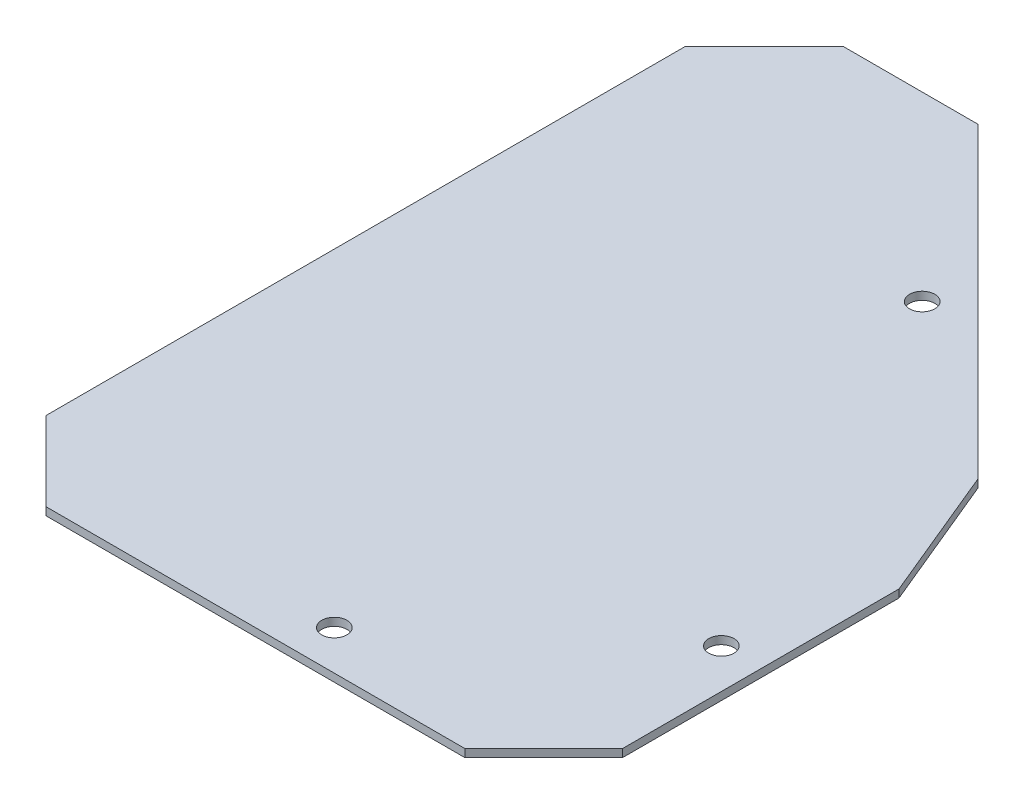
ISO-10303-21;
HEADER;
FILE_DESCRIPTION(('STEP AP214'),'2;1');
FILE_NAME('part.step','',(''),(''),'','','');
FILE_SCHEMA(('AUTOMOTIVE_DESIGN { 1 0 10303 214 1 1 1 1 }'));
ENDSEC;
DATA;
#1=APPLICATION_CONTEXT('core data for automotive mechanical design processes');
#2=APPLICATION_PROTOCOL_DEFINITION('international standard','automotive_design',2000,#1);
#3=PRODUCT_CONTEXT('',#1,'mechanical');
#4=PRODUCT('Part','Part','',(#3));
#5=PRODUCT_RELATED_PRODUCT_CATEGORY('part','',(#4));
#6=PRODUCT_DEFINITION_FORMATION('','',#4);
#7=PRODUCT_DEFINITION_CONTEXT('part definition',#1,'design');
#8=PRODUCT_DEFINITION('design','',#6,#7);
#9=PRODUCT_DEFINITION_SHAPE('','',#8);
#10=(LENGTH_UNIT() NAMED_UNIT(*) SI_UNIT(.MILLI.,.METRE.));
#11=(NAMED_UNIT(*) PLANE_ANGLE_UNIT() SI_UNIT($,.RADIAN.));
#12=(NAMED_UNIT(*) SI_UNIT($,.STERADIAN.) SOLID_ANGLE_UNIT());
#13=UNCERTAINTY_MEASURE_WITH_UNIT(LENGTH_MEASURE(1.E-05),#10,'distance_accuracy_value','');
#14=(GEOMETRIC_REPRESENTATION_CONTEXT(3) GLOBAL_UNCERTAINTY_ASSIGNED_CONTEXT((#13)) GLOBAL_UNIT_ASSIGNED_CONTEXT((#10,
#11,#12)) REPRESENTATION_CONTEXT('',''));
#15=CARTESIAN_POINT('',(0.,0.,0.));
#16=DIRECTION('',(0.,0.,1.));
#17=DIRECTION('',(1.,0.,0.));
#18=AXIS2_PLACEMENT_3D('',#15,#16,#17);
#19=CARTESIAN_POINT('',(0.,1.,0.));
#20=DIRECTION('',(0.,0.,-1.));
#21=DIRECTION('',(-1.,0.,0.));
#22=AXIS2_PLACEMENT_3D('',#19,#20,#21);
#23=PLANE('',#22);
#24=DIRECTION('',(1.,0.,0.));
#25=VECTOR('',#24,1.);
#26=CARTESIAN_POINT('',(0.,1.,0.));
#27=LINE('',#26,#25);
#28=CARTESIAN_POINT('',(-9.99999999999996,1.,0.));
#29=VERTEX_POINT('',#28);
#30=CARTESIAN_POINT('',(43.0330085889908,1.,0.));
#31=VERTEX_POINT('',#30);
#32=EDGE_CURVE('E135',#29,#31,#27,.T.);
#33=ORIENTED_EDGE('',*,*,#32,.F.);
#34=DIRECTION('',(0.,-1.,0.));
#35=VECTOR('',#34,1.);
#36=CARTESIAN_POINT('',(-9.99999999999996,0.,0.));
#37=LINE('',#36,#35);
#38=CARTESIAN_POINT('',(-9.99999999999996,0.,0.));
#39=VERTEX_POINT('',#38);
#40=EDGE_CURVE('E156',#29,#39,#37,.T.);
#41=ORIENTED_EDGE('',*,*,#40,.T.);
#42=DIRECTION('',(1.,0.,0.));
#43=VECTOR('',#42,1.);
#44=CARTESIAN_POINT('',(0.,0.,0.));
#45=LINE('',#44,#43);
#46=CARTESIAN_POINT('',(43.0330085889908,0.,0.));
#47=VERTEX_POINT('',#46);
#48=EDGE_CURVE('E183',#39,#47,#45,.T.);
#49=ORIENTED_EDGE('',*,*,#48,.T.);
#50=DIRECTION('',(0.,1.,0.));
#51=VECTOR('',#50,1.);
#52=CARTESIAN_POINT('',(43.0330085889908,1.,0.));
#53=LINE('',#52,#51);
#54=EDGE_CURVE('E146',#47,#31,#53,.T.);
#55=ORIENTED_EDGE('',*,*,#54,.T.);
#56=EDGE_LOOP('',(#33,#41,#49,#55));
#57=FACE_BOUND('',#56,.T.);
#58=ADVANCED_FACE('F43',(#57),#23,.F.);
#59=CARTESIAN_POINT('',(53.0330085889908,1.,0.));
#60=DIRECTION('',(-1.,0.,0.));
#61=DIRECTION('',(0.,0.,1.));
#62=AXIS2_PLACEMENT_3D('',#59,#60,#61);
#63=PLANE('',#62);
#64=DIRECTION('',(0.,0.,-1.));
#65=VECTOR('',#64,1.);
#66=CARTESIAN_POINT('',(53.0330085889908,0.,0.));
#67=LINE('',#66,#65);
#68=CARTESIAN_POINT('',(53.0330085889908,0.,-9.99999999999999));
#69=VERTEX_POINT('',#68);
#70=CARTESIAN_POINT('',(53.0330085889908,0.,-44.9999999999999));
#71=VERTEX_POINT('',#70);
#72=EDGE_CURVE('E131',#69,#71,#67,.T.);
#73=ORIENTED_EDGE('',*,*,#72,.T.);
#74=DIRECTION('',(0.,1.,0.));
#75=VECTOR('',#74,1.);
#76=CARTESIAN_POINT('',(53.0330085889908,1.,-44.9999999999999));
#77=LINE('',#76,#75);
#78=CARTESIAN_POINT('',(53.0330085889908,1.,-44.9999999999999));
#79=VERTEX_POINT('',#78);
#80=EDGE_CURVE('E155',#71,#79,#77,.T.);
#81=ORIENTED_EDGE('',*,*,#80,.T.);
#82=DIRECTION('',(0.,0.,-1.));
#83=VECTOR('',#82,1.);
#84=CARTESIAN_POINT('',(53.0330085889908,1.,0.));
#85=LINE('',#84,#83);
#86=CARTESIAN_POINT('',(53.0330085889908,1.,-9.99999999999999));
#87=VERTEX_POINT('',#86);
#88=EDGE_CURVE('E178',#87,#79,#85,.T.);
#89=ORIENTED_EDGE('',*,*,#88,.F.);
#90=DIRECTION('',(0.,-1.,0.));
#91=VECTOR('',#90,1.);
#92=CARTESIAN_POINT('',(53.0330085889908,1.,-9.99999999999999));
#93=LINE('',#92,#91);
#94=EDGE_CURVE('E144',#87,#69,#93,.T.);
#95=ORIENTED_EDGE('',*,*,#94,.T.);
#96=EDGE_LOOP('',(#73,#81,#89,#95));
#97=FACE_BOUND('',#96,.T.);
#98=ADVANCED_FACE('F221',(#97),#63,.F.);
#99=CARTESIAN_POINT('',(53.0330085889908,1.,-55.));
#100=DIRECTION('',(-0.707106781186552,0.,0.707106781186544));
#101=DIRECTION('',(0.707106781186544,0.,0.707106781186552));
#102=AXIS2_PLACEMENT_3D('',#99,#100,#101);
#103=PLANE('',#102);
#104=DIRECTION('',(-0.707106781186544,0.,-0.707106781186552));
#105=VECTOR('',#104,1.);
#106=CARTESIAN_POINT('',(53.0330085889908,1.,-55.));
#107=LINE('',#106,#105);
#108=CARTESIAN_POINT('',(45.9619407771253,1.,-62.0710678118656));
#109=VERTEX_POINT('',#108);
#110=CARTESIAN_POINT('',(7.07106781186549,1.,-100.961940777126));
#111=VERTEX_POINT('',#110);
#112=EDGE_CURVE('E214',#109,#111,#107,.T.);
#113=ORIENTED_EDGE('',*,*,#112,.F.);
#114=DIRECTION('',(0.,-1.,0.));
#115=VECTOR('',#114,1.);
#116=CARTESIAN_POINT('',(45.9619407771253,1.,-62.0710678118656));
#117=LINE('',#116,#115);
#118=CARTESIAN_POINT('',(45.9619407771253,0.,-62.0710678118656));
#119=VERTEX_POINT('',#118);
#120=EDGE_CURVE('E134',#109,#119,#117,.T.);
#121=ORIENTED_EDGE('',*,*,#120,.T.);
#122=DIRECTION('',(-0.707106781186544,0.,-0.707106781186552));
#123=VECTOR('',#122,1.);
#124=CARTESIAN_POINT('',(53.0330085889908,0.,-55.));
#125=LINE('',#124,#123);
#126=CARTESIAN_POINT('',(7.07106781186549,0.,-100.961940777126));
#127=VERTEX_POINT('',#126);
#128=EDGE_CURVE('E118',#119,#127,#125,.T.);
#129=ORIENTED_EDGE('',*,*,#128,.T.);
#130=DIRECTION('',(0.,1.,0.));
#131=VECTOR('',#130,1.);
#132=CARTESIAN_POINT('',(7.07106781186549,1.,-100.961940777126));
#133=LINE('',#132,#131);
#134=EDGE_CURVE('E124',#127,#111,#133,.T.);
#135=ORIENTED_EDGE('',*,*,#134,.T.);
#136=EDGE_LOOP('',(#113,#121,#129,#135));
#137=FACE_BOUND('',#136,.T.);
#138=ADVANCED_FACE('F127',(#137),#103,.F.);
#139=CARTESIAN_POINT('',(0.,1.,0.));
#140=DIRECTION('',(0.,1.,0.));
#141=DIRECTION('',(0.,0.,1.));
#142=AXIS2_PLACEMENT_3D('',#139,#140,#141);
#143=PLANE('',#142);
#144=CARTESIAN_POINT('',(22.9809703885626,0.999999999999999,-77.980970388563));
#145=DIRECTION('',(0.,1.,0.));
#146=DIRECTION('',(0.,0.,1.));
#147=AXIS2_PLACEMENT_3D('',#144,#145,#146);
#148=CIRCLE('',#147,1.60000000000001);
#149=CARTESIAN_POINT('',(22.9809703885626,0.999999999999999,-76.380970388563));
#150=VERTEX_POINT('',#149);
#151=EDGE_CURVE('E207',#150,#150,#148,.T.);
#152=ORIENTED_EDGE('',*,*,#151,.F.);
#153=EDGE_LOOP('',(#152));
#154=FACE_BOUND('',#153,.T.);
#155=CARTESIAN_POINT('',(48.0330085889908,0.999999999999999,-27.5));
#156=DIRECTION('',(0.,1.,0.));
#157=DIRECTION('',(0.,0.,1.));
#158=AXIS2_PLACEMENT_3D('',#155,#156,#157);
#159=CIRCLE('',#158,1.6);
#160=CARTESIAN_POINT('',(48.0330085889908,0.999999999999999,-25.9));
#161=VERTEX_POINT('',#160);
#162=EDGE_CURVE('E205',#161,#161,#159,.T.);
#163=ORIENTED_EDGE('',*,*,#162,.F.);
#164=EDGE_LOOP('',(#163));
#165=FACE_BOUND('',#164,.T.);
#166=CARTESIAN_POINT('',(21.5165042944954,0.999999999999999,-5.));
#167=DIRECTION('',(0.,1.,0.));
#168=DIRECTION('',(0.,0.,1.));
#169=AXIS2_PLACEMENT_3D('',#166,#167,#168);
#170=CIRCLE('',#169,1.6);
#171=CARTESIAN_POINT('',(21.5165042944954,0.999999999999999,-3.4));
#172=VERTEX_POINT('',#171);
#173=EDGE_CURVE('E192',#172,#172,#170,.T.);
#174=ORIENTED_EDGE('',*,*,#173,.F.);
#175=EDGE_LOOP('',(#174));
#176=FACE_BOUND('',#175,.T.);
#177=DIRECTION('',(0.,0.,-1.));
#178=VECTOR('',#177,1.);
#179=CARTESIAN_POINT('',(-20.,1.,0.));
#180=LINE('',#179,#178);
#181=CARTESIAN_POINT('',(-20.,1.,-10.));
#182=VERTEX_POINT('',#181);
#183=CARTESIAN_POINT('',(-20.,1.,-90.9619407771256));
#184=VERTEX_POINT('',#183);
#185=EDGE_CURVE('E171',#182,#184,#180,.T.);
#186=ORIENTED_EDGE('',*,*,#185,.F.);
#187=DIRECTION('',(0.707106781186546,0.,0.707106781186549));
#188=VECTOR('',#187,1.);
#189=CARTESIAN_POINT('',(-5.,1.,4.99999999999998));
#190=LINE('',#189,#188);
#191=EDGE_CURVE('E55',#182,#29,#190,.T.);
#192=ORIENTED_EDGE('',*,*,#191,.T.);
#193=ORIENTED_EDGE('',*,*,#32,.T.);
#194=DIRECTION('',(-0.707106781186549,0.,0.707106781186547));
#195=VECTOR('',#194,1.);
#196=CARTESIAN_POINT('',(21.5165042944953,1.,21.5165042944954));
#197=LINE('',#196,#195);
#198=EDGE_CURVE('E140',#31,#87,#197,.F.);
#199=ORIENTED_EDGE('',*,*,#198,.T.);
#200=ORIENTED_EDGE('',*,*,#88,.T.);
#201=DIRECTION('',(0.382683432365086,0.,0.923879532511288));
#202=VECTOR('',#201,1.);
#203=CARTESIAN_POINT('',(61.1764068711926,1.,-25.3400974233023));
#204=LINE('',#203,#202);
#205=EDGE_CURVE('E153',#79,#109,#204,.F.);
#206=ORIENTED_EDGE('',*,*,#205,.T.);
#207=ORIENTED_EDGE('',*,*,#112,.T.);
#208=DIRECTION('',(1.,0.,0.));
#209=VECTOR('',#208,1.);
#210=CARTESIAN_POINT('',(-1.18889686371183E-12,1.,-100.961940777126));
#211=LINE('',#210,#209);
#212=CARTESIAN_POINT('',(-10.0000000000001,1.,-100.961940777126));
#213=VERTEX_POINT('',#212);
#214=EDGE_CURVE('E136',#111,#213,#211,.F.);
#215=ORIENTED_EDGE('',*,*,#214,.T.);
#216=DIRECTION('',(-0.70710678118654,0.,0.707106781186555));
#217=VECTOR('',#216,1.);
#218=CARTESIAN_POINT('',(-55.480970388563,1.,-55.4809703885619));
#219=LINE('',#218,#217);
#220=EDGE_CURVE('E63',#213,#184,#219,.T.);
#221=ORIENTED_EDGE('',*,*,#220,.T.);
#222=EDGE_LOOP('',(#186,#192,#193,#199,#200,#206,#207,#215,#221));
#223=FACE_BOUND('',#222,.T.);
#224=ADVANCED_FACE('F167',(#154,#165,#176,#223),#143,.T.);
#225=CARTESIAN_POINT('',(0.,0.,0.));
#226=DIRECTION('',(0.,1.,0.));
#227=DIRECTION('',(0.,0.,1.));
#228=AXIS2_PLACEMENT_3D('',#225,#226,#227);
#229=PLANE('',#228);
#230=CARTESIAN_POINT('',(22.9809703885626,0.,-77.980970388563));
#231=DIRECTION('',(0.,-1.,0.));
#232=DIRECTION('',(0.,0.,-1.));
#233=AXIS2_PLACEMENT_3D('',#230,#231,#232);
#234=CIRCLE('',#233,1.60000000000001);
#235=CARTESIAN_POINT('',(22.9809703885626,0.,-79.580970388563));
#236=VERTEX_POINT('',#235);
#237=EDGE_CURVE('E191',#236,#236,#234,.T.);
#238=ORIENTED_EDGE('',*,*,#237,.F.);
#239=EDGE_LOOP('',(#238));
#240=FACE_BOUND('',#239,.T.);
#241=CARTESIAN_POINT('',(48.0330085889908,0.,-27.5));
#242=DIRECTION('',(0.,-1.,0.));
#243=DIRECTION('',(0.,0.,-1.));
#244=AXIS2_PLACEMENT_3D('',#241,#242,#243);
#245=CIRCLE('',#244,1.6);
#246=CARTESIAN_POINT('',(48.0330085889908,0.,-29.0999999999999));
#247=VERTEX_POINT('',#246);
#248=EDGE_CURVE('E197',#247,#247,#245,.T.);
#249=ORIENTED_EDGE('',*,*,#248,.F.);
#250=EDGE_LOOP('',(#249));
#251=FACE_BOUND('',#250,.T.);
#252=CARTESIAN_POINT('',(21.5165042944954,0.,-5.));
#253=DIRECTION('',(0.,-1.,0.));
#254=DIRECTION('',(0.,0.,-1.));
#255=AXIS2_PLACEMENT_3D('',#252,#253,#254);
#256=CIRCLE('',#255,1.6);
#257=CARTESIAN_POINT('',(21.5165042944954,0.,-6.6));
#258=VERTEX_POINT('',#257);
#259=EDGE_CURVE('E186',#258,#258,#256,.T.);
#260=ORIENTED_EDGE('',*,*,#259,.F.);
#261=EDGE_LOOP('',(#260));
#262=FACE_BOUND('',#261,.T.);
#263=ORIENTED_EDGE('',*,*,#48,.F.);
#264=DIRECTION('',(-0.707106781186546,0.,-0.707106781186549));
#265=VECTOR('',#264,1.);
#266=CARTESIAN_POINT('',(-9.99999999999996,0.,0.));
#267=LINE('',#266,#265);
#268=CARTESIAN_POINT('',(-20.,0.,-10.));
#269=VERTEX_POINT('',#268);
#270=EDGE_CURVE('E163',#39,#269,#267,.T.);
#271=ORIENTED_EDGE('',*,*,#270,.T.);
#272=DIRECTION('',(0.,0.,-1.));
#273=VECTOR('',#272,1.);
#274=CARTESIAN_POINT('',(-20.,0.,0.));
#275=LINE('',#274,#273);
#276=CARTESIAN_POINT('',(-20.,0.,-90.9619407771256));
#277=VERTEX_POINT('',#276);
#278=EDGE_CURVE('E185',#269,#277,#275,.T.);
#279=ORIENTED_EDGE('',*,*,#278,.T.);
#280=DIRECTION('',(0.70710678118654,0.,-0.707106781186555));
#281=VECTOR('',#280,1.);
#282=CARTESIAN_POINT('',(-20.,0.,-90.9619407771256));
#283=LINE('',#282,#281);
#284=CARTESIAN_POINT('',(-10.0000000000001,0.,-100.961940777126));
#285=VERTEX_POINT('',#284);
#286=EDGE_CURVE('E122',#277,#285,#283,.T.);
#287=ORIENTED_EDGE('',*,*,#286,.T.);
#288=DIRECTION('',(-1.,0.,0.));
#289=VECTOR('',#288,1.);
#290=CARTESIAN_POINT('',(0.,0.,-100.961940777126));
#291=LINE('',#290,#289);
#292=EDGE_CURVE('E114',#285,#127,#291,.F.);
#293=ORIENTED_EDGE('',*,*,#292,.T.);
#294=ORIENTED_EDGE('',*,*,#128,.F.);
#295=DIRECTION('',(-0.382683432365086,0.,-0.923879532511288));
#296=VECTOR('',#295,1.);
#297=CARTESIAN_POINT('',(45.9619407771253,0.,-62.0710678118656));
#298=LINE('',#297,#296);
#299=EDGE_CURVE('E152',#119,#71,#298,.F.);
#300=ORIENTED_EDGE('',*,*,#299,.T.);
#301=ORIENTED_EDGE('',*,*,#72,.F.);
#302=DIRECTION('',(0.707106781186549,0.,-0.707106781186547));
#303=VECTOR('',#302,1.);
#304=CARTESIAN_POINT('',(53.0330085889908,0.,-9.99999999999999));
#305=LINE('',#304,#303);
#306=EDGE_CURVE('E121',#69,#47,#305,.F.);
#307=ORIENTED_EDGE('',*,*,#306,.T.);
#308=EDGE_LOOP('',(#263,#271,#279,#287,#293,#294,#300,#301,#307));
#309=FACE_BOUND('',#308,.T.);
#310=ADVANCED_FACE('F117',(#240,#251,#262,#309),#229,.F.);
#311=CARTESIAN_POINT('',(0.,1.,-100.961940777126));
#312=DIRECTION('',(0.,0.,1.));
#313=DIRECTION('',(0.,-1.,0.));
#314=AXIS2_PLACEMENT_3D('',#311,#312,#313);
#315=PLANE('',#314);
#316=ORIENTED_EDGE('',*,*,#292,.F.);
#317=DIRECTION('',(0.,-1.,0.));
#318=VECTOR('',#317,1.);
#319=CARTESIAN_POINT('',(-10.0000000000001,1.,-100.961940777126));
#320=LINE('',#319,#318);
#321=EDGE_CURVE('E11',#285,#213,#320,.F.);
#322=ORIENTED_EDGE('',*,*,#321,.T.);
#323=ORIENTED_EDGE('',*,*,#214,.F.);
#324=ORIENTED_EDGE('',*,*,#134,.F.);
#325=EDGE_LOOP('',(#316,#322,#323,#324));
#326=FACE_BOUND('',#325,.T.);
#327=ADVANCED_FACE('F139',(#326),#315,.F.);
#328=CARTESIAN_POINT('',(53.0330085889908,1.,-9.99999999999999));
#329=DIRECTION('',(-0.707106781186546,0.,-0.707106781186548));
#330=DIRECTION('',(0.,-1.,0.));
#331=AXIS2_PLACEMENT_3D('',#328,#329,#330);
#332=PLANE('',#331);
#333=ORIENTED_EDGE('',*,*,#198,.F.);
#334=ORIENTED_EDGE('',*,*,#54,.F.);
#335=ORIENTED_EDGE('',*,*,#306,.F.);
#336=ORIENTED_EDGE('',*,*,#94,.F.);
#337=EDGE_LOOP('',(#333,#334,#335,#336));
#338=FACE_BOUND('',#337,.T.);
#339=ADVANCED_FACE('F220',(#338),#332,.F.);
#340=CARTESIAN_POINT('',(45.9619407771253,1.,-62.0710678118656));
#341=DIRECTION('',(-0.923879532511288,0.,0.382683432365086));
#342=DIRECTION('',(0.,-1.,0.));
#343=AXIS2_PLACEMENT_3D('',#340,#341,#342);
#344=PLANE('',#343);
#345=ORIENTED_EDGE('',*,*,#205,.F.);
#346=ORIENTED_EDGE('',*,*,#80,.F.);
#347=ORIENTED_EDGE('',*,*,#299,.F.);
#348=ORIENTED_EDGE('',*,*,#120,.F.);
#349=EDGE_LOOP('',(#345,#346,#347,#348));
#350=FACE_BOUND('',#349,.T.);
#351=ADVANCED_FACE('F222',(#350),#344,.F.);
#352=CARTESIAN_POINT('',(21.5165042944954,10.,-5.));
#353=DIRECTION('',(0.,-1.,0.));
#354=DIRECTION('',(0.,0.,-1.));
#355=AXIS2_PLACEMENT_3D('',#352,#353,#354);
#356=CYLINDRICAL_SURFACE('',#355,1.6);
#357=ORIENTED_EDGE('',*,*,#173,.T.);
#358=EDGE_LOOP('',(#357));
#359=FACE_BOUND('',#358,.T.);
#360=ORIENTED_EDGE('',*,*,#259,.T.);
#361=EDGE_LOOP('',(#360));
#362=FACE_BOUND('',#361,.T.);
#363=ADVANCED_FACE('F259',(#359,#362),#356,.F.);
#364=CARTESIAN_POINT('',(48.0330085889908,10.,-27.5));
#365=DIRECTION('',(0.,-1.,0.));
#366=DIRECTION('',(0.,0.,-1.));
#367=AXIS2_PLACEMENT_3D('',#364,#365,#366);
#368=CYLINDRICAL_SURFACE('',#367,1.6);
#369=ORIENTED_EDGE('',*,*,#162,.T.);
#370=EDGE_LOOP('',(#369));
#371=FACE_BOUND('',#370,.T.);
#372=ORIENTED_EDGE('',*,*,#248,.T.);
#373=EDGE_LOOP('',(#372));
#374=FACE_BOUND('',#373,.T.);
#375=ADVANCED_FACE('F263',(#371,#374),#368,.F.);
#376=CARTESIAN_POINT('',(22.9809703885626,10.,-77.980970388563));
#377=DIRECTION('',(0.,-1.,0.));
#378=DIRECTION('',(0.,0.,-1.));
#379=AXIS2_PLACEMENT_3D('',#376,#377,#378);
#380=CYLINDRICAL_SURFACE('',#379,1.60000000000001);
#381=ORIENTED_EDGE('',*,*,#151,.T.);
#382=EDGE_LOOP('',(#381));
#383=FACE_BOUND('',#382,.T.);
#384=ORIENTED_EDGE('',*,*,#237,.T.);
#385=EDGE_LOOP('',(#384));
#386=FACE_BOUND('',#385,.T.);
#387=ADVANCED_FACE('F272',(#383,#386),#380,.F.);
#388=CARTESIAN_POINT('',(-20.,103.923823702211,0.));
#389=DIRECTION('',(-1.,0.,0.));
#390=DIRECTION('',(0.,0.,1.));
#391=AXIS2_PLACEMENT_3D('',#388,#389,#390);
#392=PLANE('',#391);
#393=ORIENTED_EDGE('',*,*,#278,.F.);
#394=DIRECTION('',(0.,1.,0.));
#395=VECTOR('',#394,1.);
#396=CARTESIAN_POINT('',(-20.,1.00000000000003,-10.));
#397=LINE('',#396,#395);
#398=EDGE_CURVE('E168',#269,#182,#397,.T.);
#399=ORIENTED_EDGE('',*,*,#398,.T.);
#400=ORIENTED_EDGE('',*,*,#185,.T.);
#401=DIRECTION('',(0.,-1.,0.));
#402=VECTOR('',#401,1.);
#403=CARTESIAN_POINT('',(-20.,103.923823702211,-90.9619407771256));
#404=LINE('',#403,#402);
#405=EDGE_CURVE('E161',#184,#277,#404,.T.);
#406=ORIENTED_EDGE('',*,*,#405,.T.);
#407=EDGE_LOOP('',(#393,#399,#400,#406));
#408=FACE_BOUND('',#407,.T.);
#409=ADVANCED_FACE('F187',(#408),#392,.T.);
#410=CARTESIAN_POINT('',(-9.99999999999996,1.,0.));
#411=DIRECTION('',(-0.707106781186549,0.,0.707106781186546));
#412=DIRECTION('',(0.,1.,0.));
#413=AXIS2_PLACEMENT_3D('',#410,#411,#412);
#414=PLANE('',#413);
#415=ORIENTED_EDGE('',*,*,#191,.F.);
#416=ORIENTED_EDGE('',*,*,#398,.F.);
#417=ORIENTED_EDGE('',*,*,#270,.F.);
#418=ORIENTED_EDGE('',*,*,#40,.F.);
#419=EDGE_LOOP('',(#415,#416,#417,#418));
#420=FACE_BOUND('',#419,.T.);
#421=ADVANCED_FACE('F179',(#420),#414,.T.);
#422=CARTESIAN_POINT('',(-20.,103.923823702211,-90.9619407771256));
#423=DIRECTION('',(-0.707106781186555,0.,-0.70710678118654));
#424=DIRECTION('',(0.,1.,0.));
#425=AXIS2_PLACEMENT_3D('',#422,#423,#424);
#426=PLANE('',#425);
#427=ORIENTED_EDGE('',*,*,#220,.F.);
#428=ORIENTED_EDGE('',*,*,#321,.F.);
#429=ORIENTED_EDGE('',*,*,#286,.F.);
#430=ORIENTED_EDGE('',*,*,#405,.F.);
#431=EDGE_LOOP('',(#427,#428,#429,#430));
#432=FACE_BOUND('',#431,.T.);
#433=ADVANCED_FACE('F46',(#432),#426,.T.);
#434=CLOSED_SHELL('',(#58,#98,#138,#224,#310,#327,#339,#351,#363,#375,#387,#409,#421,#433));
#435=MANIFOLD_SOLID_BREP('B2',#434);
#436=ADVANCED_BREP_SHAPE_REPRESENTATION('',(#18,#435),#14);
#437=SHAPE_DEFINITION_REPRESENTATION(#9,#436);
ENDSEC;
END-ISO-10303-21;
